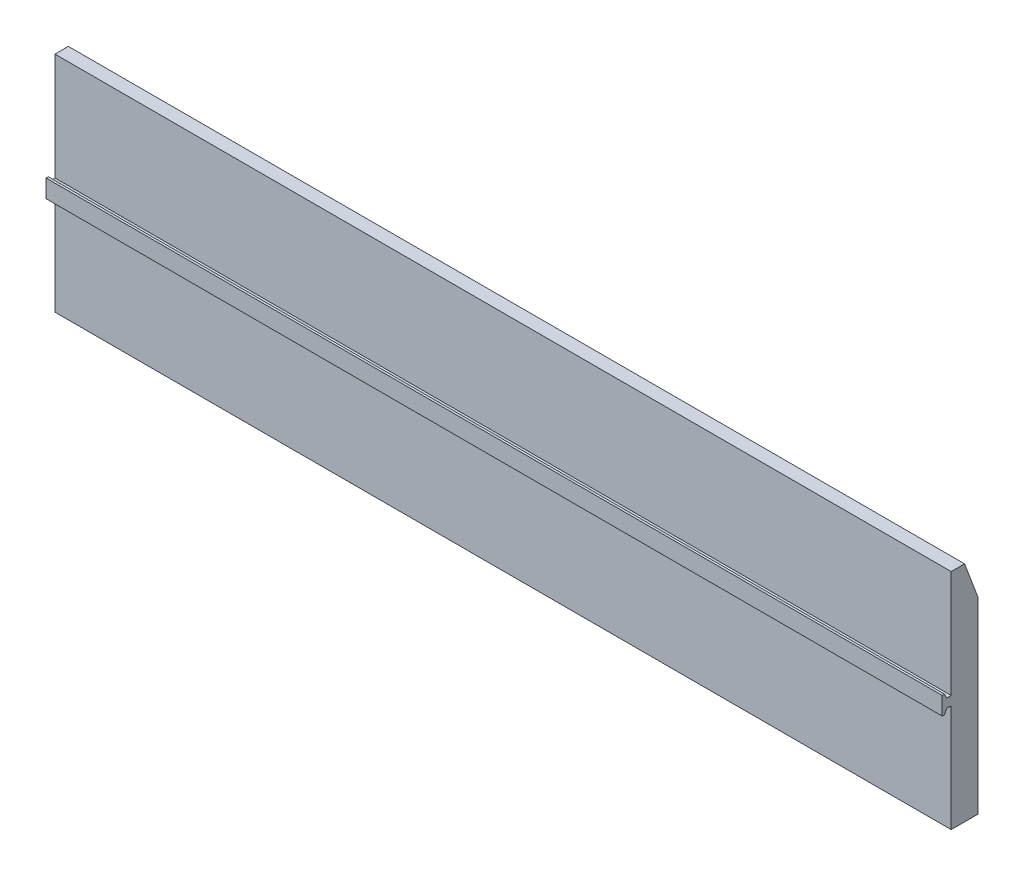
ISO-10303-21;
HEADER;
FILE_DESCRIPTION(('STEP AP214'),'2;1');
FILE_NAME('part.step','',(''),(''),'','','');
FILE_SCHEMA(('AUTOMOTIVE_DESIGN { 1 0 10303 214 1 1 1 1 }'));
ENDSEC;
DATA;
#1=APPLICATION_CONTEXT('core data for automotive mechanical design processes');
#2=APPLICATION_PROTOCOL_DEFINITION('international standard','automotive_design',2000,#1);
#3=PRODUCT_CONTEXT('',#1,'mechanical');
#4=PRODUCT('Part','Part','',(#3));
#5=PRODUCT_RELATED_PRODUCT_CATEGORY('part','',(#4));
#6=PRODUCT_DEFINITION_FORMATION('','',#4);
#7=PRODUCT_DEFINITION_CONTEXT('part definition',#1,'design');
#8=PRODUCT_DEFINITION('design','',#6,#7);
#9=PRODUCT_DEFINITION_SHAPE('','',#8);
#10=(LENGTH_UNIT() NAMED_UNIT(*) SI_UNIT(.MILLI.,.METRE.));
#11=(NAMED_UNIT(*) PLANE_ANGLE_UNIT() SI_UNIT($,.RADIAN.));
#12=(NAMED_UNIT(*) SI_UNIT($,.STERADIAN.) SOLID_ANGLE_UNIT());
#13=UNCERTAINTY_MEASURE_WITH_UNIT(LENGTH_MEASURE(1.E-05),#10,'distance_accuracy_value','');
#14=(GEOMETRIC_REPRESENTATION_CONTEXT(3) GLOBAL_UNCERTAINTY_ASSIGNED_CONTEXT((#13)) GLOBAL_UNIT_ASSIGNED_CONTEXT((#10,
#11,#12)) REPRESENTATION_CONTEXT('',''));
#15=CARTESIAN_POINT('',(0.,0.,0.));
#16=DIRECTION('',(0.,0.,1.));
#17=DIRECTION('',(1.,0.,0.));
#18=AXIS2_PLACEMENT_3D('',#15,#16,#17);
#19=CARTESIAN_POINT('',(25.0000000000001,80.,74.9999999999981));
#20=DIRECTION('',(0.,1.,0.));
#21=DIRECTION('',(0.,0.,1.));
#22=AXIS2_PLACEMENT_3D('',#19,#20,#21);
#23=PLANE('',#22);
#24=CARTESIAN_POINT('',(215.,80.,14.9999999999993));
#25=DIRECTION('',(0.,1.,0.));
#26=DIRECTION('',(0.,0.,1.));
#27=AXIS2_PLACEMENT_3D('',#24,#25,#26);
#28=CIRCLE('',#27,12.);
#29=CARTESIAN_POINT('',(215.,80.,26.9999999999993));
#30=VERTEX_POINT('',#29);
#31=EDGE_CURVE('E410',#30,#30,#28,.T.);
#32=ORIENTED_EDGE('',*,*,#31,.F.);
#33=EDGE_LOOP('',(#32));
#34=FACE_BOUND('',#33,.T.);
#35=CARTESIAN_POINT('',(286.25,80.,14.9999999999993));
#36=DIRECTION('',(0.,1.,0.));
#37=DIRECTION('',(0.,0.,1.));
#38=AXIS2_PLACEMENT_3D('',#35,#36,#37);
#39=CIRCLE('',#38,12.);
#40=CARTESIAN_POINT('',(286.25,80.,26.9999999999993));
#41=VERTEX_POINT('',#40);
#42=EDGE_CURVE('E412',#41,#41,#39,.T.);
#43=ORIENTED_EDGE('',*,*,#42,.F.);
#44=EDGE_LOOP('',(#43));
#45=FACE_BOUND('',#44,.T.);
#46=DIRECTION('',(1.,0.,0.));
#47=VECTOR('',#46,1.);
#48=CARTESIAN_POINT('',(25.0000000000001,80.,-45.0000000000018));
#49=LINE('',#48,#47);
#50=CARTESIAN_POINT('',(175.,80.,-45.0000000000018));
#51=VERTEX_POINT('',#50);
#52=CARTESIAN_POINT('',(326.25,80.,-45.0000000000018));
#53=VERTEX_POINT('',#52);
#54=EDGE_CURVE('E181',#51,#53,#49,.T.);
#55=ORIENTED_EDGE('',*,*,#54,.F.);
#56=DIRECTION('',(0.,0.,-1.));
#57=VECTOR('',#56,1.);
#58=CARTESIAN_POINT('',(175.,80.,74.9999999999981));
#59=LINE('',#58,#57);
#60=CARTESIAN_POINT('',(175.,80.,74.9999999999982));
#61=VERTEX_POINT('',#60);
#62=EDGE_CURVE('E204',#61,#51,#59,.T.);
#63=ORIENTED_EDGE('',*,*,#62,.F.);
#64=DIRECTION('',(1.,0.,0.));
#65=VECTOR('',#64,1.);
#66=CARTESIAN_POINT('',(25.0000000000001,80.,74.9999999999981));
#67=LINE('',#66,#65);
#68=CARTESIAN_POINT('',(326.25,80.,75.0000000000004));
#69=VERTEX_POINT('',#68);
#70=EDGE_CURVE('E305',#61,#69,#67,.T.);
#71=ORIENTED_EDGE('',*,*,#70,.T.);
#72=DIRECTION('',(0.,0.,1.));
#73=VECTOR('',#72,1.);
#74=CARTESIAN_POINT('',(326.25,80.,74.9999999999981));
#75=LINE('',#74,#73);
#76=EDGE_CURVE('E221',#53,#69,#75,.T.);
#77=ORIENTED_EDGE('',*,*,#76,.F.);
#78=EDGE_LOOP('',(#55,#63,#71,#77));
#79=FACE_BOUND('',#78,.T.);
#80=ADVANCED_FACE('F38',(#34,#45,#79),#23,.T.);
#81=CARTESIAN_POINT('',(25.0000000000001,300.,104.999999999998));
#82=DIRECTION('',(0.,1.,0.));
#83=DIRECTION('',(0.,0.,1.));
#84=AXIS2_PLACEMENT_3D('',#81,#82,#83);
#85=PLANE('',#84);
#86=DIRECTION('',(0.,0.,1.));
#87=VECTOR('',#86,1.);
#88=CARTESIAN_POINT('',(1027.5,300.,104.999999999998));
#89=LINE('',#88,#87);
#90=CARTESIAN_POINT('',(1027.5,300.,89.999999999998));
#91=VERTEX_POINT('',#90);
#92=CARTESIAN_POINT('',(1027.5,300.,104.999999999998));
#93=VERTEX_POINT('',#92);
#94=EDGE_CURVE('E223',#91,#93,#89,.T.);
#95=ORIENTED_EDGE('',*,*,#94,.F.);
#96=DIRECTION('',(1.,0.,0.));
#97=VECTOR('',#96,1.);
#98=CARTESIAN_POINT('',(25.0000000000001,300.,89.999999999998));
#99=LINE('',#98,#97);
#100=CARTESIAN_POINT('',(25.0000000000001,300.,89.999999999998));
#101=VERTEX_POINT('',#100);
#102=EDGE_CURVE('E46',#101,#91,#99,.T.);
#103=ORIENTED_EDGE('',*,*,#102,.F.);
#104=DIRECTION('',(0.,0.,1.));
#105=VECTOR('',#104,1.);
#106=CARTESIAN_POINT('',(25.0000000000001,300.,104.999999999998));
#107=LINE('',#106,#105);
#108=CARTESIAN_POINT('',(25.0000000000001,300.,104.999999999998));
#109=VERTEX_POINT('',#108);
#110=EDGE_CURVE('E224',#101,#109,#107,.T.);
#111=ORIENTED_EDGE('',*,*,#110,.T.);
#112=DIRECTION('',(1.,0.,0.));
#113=VECTOR('',#112,1.);
#114=CARTESIAN_POINT('',(25.0000000000001,300.,104.999999999998));
#115=LINE('',#114,#113);
#116=EDGE_CURVE('E264',#109,#93,#115,.T.);
#117=ORIENTED_EDGE('',*,*,#116,.T.);
#118=EDGE_LOOP('',(#95,#103,#111,#117));
#119=FACE_BOUND('',#118,.T.);
#120=ADVANCED_FACE('F40',(#119),#85,.T.);
#121=CARTESIAN_POINT('',(25.0000000000001,300.,89.999999999998));
#122=DIRECTION('',(0.,0.351123441588388,-0.936329177569046));
#123=DIRECTION('',(0.,0.936329177569046,0.351123441588388));
#124=AXIS2_PLACEMENT_3D('',#121,#122,#123);
#125=PLANE('',#124);
#126=DIRECTION('',(0.,0.936329177569046,0.351123441588388));
#127=VECTOR('',#126,1.);
#128=CARTESIAN_POINT('',(1027.5,300.,89.999999999998));
#129=LINE('',#128,#127);
#130=CARTESIAN_POINT('',(1027.5,260.,74.9999999999982));
#131=VERTEX_POINT('',#130);
#132=EDGE_CURVE('E228',#131,#91,#129,.T.);
#133=ORIENTED_EDGE('',*,*,#132,.F.);
#134=DIRECTION('',(1.,0.,0.));
#135=VECTOR('',#134,1.);
#136=CARTESIAN_POINT('',(25.0000000000001,260.,74.9999999999982));
#137=LINE('',#136,#135);
#138=CARTESIAN_POINT('',(25.0000000000001,260.,74.9999999999982));
#139=VERTEX_POINT('',#138);
#140=EDGE_CURVE('E303',#139,#131,#137,.T.);
#141=ORIENTED_EDGE('',*,*,#140,.F.);
#142=DIRECTION('',(0.,0.936329177569046,0.351123441588388));
#143=VECTOR('',#142,1.);
#144=CARTESIAN_POINT('',(25.0000000000001,300.,89.999999999998));
#145=LINE('',#144,#143);
#146=EDGE_CURVE('E261',#139,#101,#145,.T.);
#147=ORIENTED_EDGE('',*,*,#146,.T.);
#148=ORIENTED_EDGE('',*,*,#102,.T.);
#149=EDGE_LOOP('',(#133,#141,#147,#148));
#150=FACE_BOUND('',#149,.T.);
#151=ADVANCED_FACE('F339',(#150),#125,.T.);
#152=CARTESIAN_POINT('',(25.0000000000001,260.,74.9999999999982));
#153=DIRECTION('',(0.,0.,-1.));
#154=DIRECTION('',(0.,1.,0.));
#155=AXIS2_PLACEMENT_3D('',#152,#153,#154);
#156=PLANE('',#155);
#157=ORIENTED_EDGE('',*,*,#70,.F.);
#158=DIRECTION('',(0.,1.,0.));
#159=VECTOR('',#158,1.);
#160=CARTESIAN_POINT('',(175.,50.,74.9999999999982));
#161=LINE('',#160,#159);
#162=CARTESIAN_POINT('',(175.,50.,74.9999999999982));
#163=VERTEX_POINT('',#162);
#164=EDGE_CURVE('E381',#163,#61,#161,.T.);
#165=ORIENTED_EDGE('',*,*,#164,.F.);
#166=DIRECTION('',(1.,0.,0.));
#167=VECTOR('',#166,1.);
#168=CARTESIAN_POINT('',(24.9999999999997,50.,74.9999999999982));
#169=LINE('',#168,#167);
#170=CARTESIAN_POINT('',(25.0000000000001,50.,74.9999999999982));
#171=VERTEX_POINT('',#170);
#172=EDGE_CURVE('E378',#171,#163,#169,.T.);
#173=ORIENTED_EDGE('',*,*,#172,.F.);
#174=DIRECTION('',(0.,1.,0.));
#175=VECTOR('',#174,1.);
#176=CARTESIAN_POINT('',(25.0000000000001,260.,74.9999999999982));
#177=LINE('',#176,#175);
#178=EDGE_CURVE('E258',#171,#139,#177,.T.);
#179=ORIENTED_EDGE('',*,*,#178,.T.);
#180=ORIENTED_EDGE('',*,*,#140,.T.);
#181=DIRECTION('',(0.,1.,0.));
#182=VECTOR('',#181,1.);
#183=CARTESIAN_POINT('',(1027.5,260.,74.9999999999982));
#184=LINE('',#183,#182);
#185=CARTESIAN_POINT('',(1027.5,50.,75.0000000000005));
#186=VERTEX_POINT('',#185);
#187=EDGE_CURVE('E297',#186,#131,#184,.T.);
#188=ORIENTED_EDGE('',*,*,#187,.F.);
#189=DIRECTION('',(1.,0.,0.));
#190=VECTOR('',#189,1.);
#191=CARTESIAN_POINT('',(1027.5,50.,75.0000000000005));
#192=LINE('',#191,#190);
#193=CARTESIAN_POINT('',(877.5,50.,75.0000000000004));
#194=VERTEX_POINT('',#193);
#195=EDGE_CURVE('E385',#194,#186,#192,.T.);
#196=ORIENTED_EDGE('',*,*,#195,.F.);
#197=DIRECTION('',(0.,1.,0.));
#198=VECTOR('',#197,1.);
#199=CARTESIAN_POINT('',(877.5,50.,75.0000000000004));
#200=LINE('',#199,#198);
#201=CARTESIAN_POINT('',(877.5,80.,75.0000000000004));
#202=VERTEX_POINT('',#201);
#203=EDGE_CURVE('E392',#194,#202,#200,.T.);
#204=ORIENTED_EDGE('',*,*,#203,.T.);
#205=CARTESIAN_POINT('',(726.25,80.,75.0000000000004));
#206=VERTEX_POINT('',#205);
#207=EDGE_CURVE('E308',#206,#202,#67,.T.);
#208=ORIENTED_EDGE('',*,*,#207,.F.);
#209=DIRECTION('',(0.,1.,0.));
#210=VECTOR('',#209,1.);
#211=CARTESIAN_POINT('',(726.25,50.,75.0000000000004));
#212=LINE('',#211,#210);
#213=CARTESIAN_POINT('',(726.25,50.,75.0000000000004));
#214=VERTEX_POINT('',#213);
#215=EDGE_CURVE('E215',#214,#206,#212,.T.);
#216=ORIENTED_EDGE('',*,*,#215,.F.);
#217=DIRECTION('',(1.,0.,0.));
#218=VECTOR('',#217,1.);
#219=CARTESIAN_POINT('',(326.25,50.,75.0000000000004));
#220=LINE('',#219,#218);
#221=CARTESIAN_POINT('',(326.25,50.,75.0000000000004));
#222=VERTEX_POINT('',#221);
#223=EDGE_CURVE('E203',#222,#214,#220,.T.);
#224=ORIENTED_EDGE('',*,*,#223,.F.);
#225=DIRECTION('',(0.,1.,0.));
#226=VECTOR('',#225,1.);
#227=CARTESIAN_POINT('',(326.25,50.,75.0000000000004));
#228=LINE('',#227,#226);
#229=EDGE_CURVE('E201',#222,#69,#228,.T.);
#230=ORIENTED_EDGE('',*,*,#229,.T.);
#231=EDGE_LOOP('',(#157,#165,#173,#179,#180,#188,#196,#204,#208,#216,#224,#230));
#232=FACE_BOUND('',#231,.T.);
#233=ADVANCED_FACE('F380',(#232),#156,.T.);
#234=CARTESIAN_POINT('',(766.25,80.,14.9999999999993));
#235=DIRECTION('',(0.,1.,0.));
#236=DIRECTION('',(0.,0.,1.));
#237=AXIS2_PLACEMENT_3D('',#234,#235,#236);
#238=CIRCLE('',#237,12.);
#239=CARTESIAN_POINT('',(766.25,80.,26.9999999999993));
#240=VERTEX_POINT('',#239);
#241=EDGE_CURVE('E419',#240,#240,#238,.T.);
#242=ORIENTED_EDGE('',*,*,#241,.F.);
#243=EDGE_LOOP('',(#242));
#244=FACE_BOUND('',#243,.T.);
#245=CARTESIAN_POINT('',(837.5,80.,14.9999999999993));
#246=DIRECTION('',(0.,1.,0.));
#247=DIRECTION('',(0.,0.,1.));
#248=AXIS2_PLACEMENT_3D('',#245,#246,#247);
#249=CIRCLE('',#248,12.);
#250=CARTESIAN_POINT('',(837.5,80.,26.9999999999993));
#251=VERTEX_POINT('',#250);
#252=EDGE_CURVE('E422',#251,#251,#249,.T.);
#253=ORIENTED_EDGE('',*,*,#252,.F.);
#254=EDGE_LOOP('',(#253));
#255=FACE_BOUND('',#254,.T.);
#256=DIRECTION('',(1.,0.,0.));
#257=VECTOR('',#256,1.);
#258=CARTESIAN_POINT('',(25.0000000000001,80.,-45.0000000000018));
#259=LINE('',#258,#257);
#260=CARTESIAN_POINT('',(726.25,80.,-45.0000000000018));
#261=VERTEX_POINT('',#260);
#262=CARTESIAN_POINT('',(877.5,80.,-45.0000000000018));
#263=VERTEX_POINT('',#262);
#264=EDGE_CURVE('E53',#261,#263,#259,.T.);
#265=ORIENTED_EDGE('',*,*,#264,.F.);
#266=DIRECTION('',(0.,0.,-1.));
#267=VECTOR('',#266,1.);
#268=CARTESIAN_POINT('',(726.25,80.,74.9999999999981));
#269=LINE('',#268,#267);
#270=EDGE_CURVE('E217',#206,#261,#269,.T.);
#271=ORIENTED_EDGE('',*,*,#270,.F.);
#272=ORIENTED_EDGE('',*,*,#207,.T.);
#273=DIRECTION('',(0.,0.,1.));
#274=VECTOR('',#273,1.);
#275=CARTESIAN_POINT('',(877.5,80.,74.9999999999971));
#276=LINE('',#275,#274);
#277=EDGE_CURVE('E209',#263,#202,#276,.T.);
#278=ORIENTED_EDGE('',*,*,#277,.F.);
#279=EDGE_LOOP('',(#265,#271,#272,#278));
#280=FACE_BOUND('',#279,.T.);
#281=ADVANCED_FACE('F406',(#244,#255,#280),#23,.T.);
#282=CARTESIAN_POINT('',(25.0000000000001,50.,74.9999999999982));
#283=DIRECTION('',(0.,-1.,0.));
#284=DIRECTION('',(0.,0.,-1.));
#285=AXIS2_PLACEMENT_3D('',#282,#283,#284);
#286=PLANE('',#285);
#287=CARTESIAN_POINT('',(215.,50.,14.9999999999993));
#288=DIRECTION('',(0.,1.,0.));
#289=DIRECTION('',(0.,0.,1.));
#290=AXIS2_PLACEMENT_3D('',#287,#288,#289);
#291=CIRCLE('',#290,12.);
#292=CARTESIAN_POINT('',(215.,50.,26.9999999999993));
#293=VERTEX_POINT('',#292);
#294=EDGE_CURVE('E425',#293,#293,#291,.T.);
#295=ORIENTED_EDGE('',*,*,#294,.T.);
#296=EDGE_LOOP('',(#295));
#297=FACE_BOUND('',#296,.T.);
#298=CARTESIAN_POINT('',(286.25,50.,14.9999999999993));
#299=DIRECTION('',(0.,1.,0.));
#300=DIRECTION('',(0.,0.,1.));
#301=AXIS2_PLACEMENT_3D('',#298,#299,#300);
#302=CIRCLE('',#301,12.);
#303=CARTESIAN_POINT('',(286.25,50.,26.9999999999993));
#304=VERTEX_POINT('',#303);
#305=EDGE_CURVE('E432',#304,#304,#302,.T.);
#306=ORIENTED_EDGE('',*,*,#305,.T.);
#307=EDGE_LOOP('',(#306));
#308=FACE_BOUND('',#307,.T.);
#309=CARTESIAN_POINT('',(766.25,50.,14.9999999999993));
#310=DIRECTION('',(0.,1.,0.));
#311=DIRECTION('',(0.,0.,1.));
#312=AXIS2_PLACEMENT_3D('',#309,#310,#311);
#313=CIRCLE('',#312,12.);
#314=CARTESIAN_POINT('',(766.25,50.,26.9999999999993));
#315=VERTEX_POINT('',#314);
#316=EDGE_CURVE('E429',#315,#315,#313,.T.);
#317=ORIENTED_EDGE('',*,*,#316,.T.);
#318=EDGE_LOOP('',(#317));
#319=FACE_BOUND('',#318,.T.);
#320=CARTESIAN_POINT('',(837.5,50.,14.9999999999993));
#321=DIRECTION('',(0.,1.,0.));
#322=DIRECTION('',(0.,0.,1.));
#323=AXIS2_PLACEMENT_3D('',#320,#321,#322);
#324=CIRCLE('',#323,12.);
#325=CARTESIAN_POINT('',(837.5,50.,26.9999999999993));
#326=VERTEX_POINT('',#325);
#327=EDGE_CURVE('E426',#326,#326,#324,.T.);
#328=ORIENTED_EDGE('',*,*,#327,.T.);
#329=EDGE_LOOP('',(#328));
#330=FACE_BOUND('',#329,.T.);
#331=DIRECTION('',(1.,0.,0.));
#332=VECTOR('',#331,1.);
#333=CARTESIAN_POINT('',(45.4316577057523,50.,-45.0000000000018));
#334=LINE('',#333,#332);
#335=CARTESIAN_POINT('',(726.25,50.,-45.0000000000018));
#336=VERTEX_POINT('',#335);
#337=CARTESIAN_POINT('',(877.5,50.,-45.0000000000018));
#338=VERTEX_POINT('',#337);
#339=EDGE_CURVE('E197',#336,#338,#334,.T.);
#340=ORIENTED_EDGE('',*,*,#339,.T.);
#341=DIRECTION('',(0.,0.,1.));
#342=VECTOR('',#341,1.);
#343=CARTESIAN_POINT('',(877.5,50.,-110.));
#344=LINE('',#343,#342);
#345=EDGE_CURVE('E382',#338,#194,#344,.T.);
#346=ORIENTED_EDGE('',*,*,#345,.T.);
#347=ORIENTED_EDGE('',*,*,#195,.T.);
#348=DIRECTION('',(0.,0.,-1.));
#349=VECTOR('',#348,1.);
#350=CARTESIAN_POINT('',(1027.5,50.,74.9999999999982));
#351=LINE('',#350,#349);
#352=CARTESIAN_POINT('',(1027.5,50.,104.999999999998));
#353=VERTEX_POINT('',#352);
#354=EDGE_CURVE('E294',#353,#186,#351,.T.);
#355=ORIENTED_EDGE('',*,*,#354,.F.);
#356=DIRECTION('',(1.,0.,0.));
#357=VECTOR('',#356,1.);
#358=CARTESIAN_POINT('',(25.0000000000001,50.,104.999999999998));
#359=LINE('',#358,#357);
#360=CARTESIAN_POINT('',(25.0000000000001,50.,104.999999999998));
#361=VERTEX_POINT('',#360);
#362=EDGE_CURVE('E309',#361,#353,#359,.T.);
#363=ORIENTED_EDGE('',*,*,#362,.F.);
#364=DIRECTION('',(0.,0.,-1.));
#365=VECTOR('',#364,1.);
#366=CARTESIAN_POINT('',(25.0000000000001,50.,74.9999999999982));
#367=LINE('',#366,#365);
#368=EDGE_CURVE('E255',#361,#171,#367,.T.);
#369=ORIENTED_EDGE('',*,*,#368,.T.);
#370=ORIENTED_EDGE('',*,*,#172,.T.);
#371=DIRECTION('',(0.,0.,-1.));
#372=VECTOR('',#371,1.);
#373=CARTESIAN_POINT('',(175.,50.,-110.000000000002));
#374=LINE('',#373,#372);
#375=CARTESIAN_POINT('',(175.,50.,-45.0000000000019));
#376=VERTEX_POINT('',#375);
#377=EDGE_CURVE('E196',#163,#376,#374,.T.);
#378=ORIENTED_EDGE('',*,*,#377,.T.);
#379=CARTESIAN_POINT('',(326.25,50.,-45.0000000000018));
#380=VERTEX_POINT('',#379);
#381=EDGE_CURVE('E61',#376,#380,#334,.T.);
#382=ORIENTED_EDGE('',*,*,#381,.T.);
#383=DIRECTION('',(0.,0.,1.));
#384=VECTOR('',#383,1.);
#385=CARTESIAN_POINT('',(326.25,50.,-110.000000000002));
#386=LINE('',#385,#384);
#387=EDGE_CURVE('E192',#380,#222,#386,.T.);
#388=ORIENTED_EDGE('',*,*,#387,.T.);
#389=ORIENTED_EDGE('',*,*,#223,.T.);
#390=DIRECTION('',(0.,0.,-1.));
#391=VECTOR('',#390,1.);
#392=CARTESIAN_POINT('',(726.25,50.,-110.000000000002));
#393=LINE('',#392,#391);
#394=EDGE_CURVE('E206',#214,#336,#393,.T.);
#395=ORIENTED_EDGE('',*,*,#394,.T.);
#396=EDGE_LOOP('',(#340,#346,#347,#355,#363,#369,#370,#378,#382,#388,#389,#395));
#397=FACE_BOUND('',#396,.T.);
#398=ADVANCED_FACE('F190',(#297,#308,#319,#330,#397),#286,.T.);
#399=CARTESIAN_POINT('',(25.0000000000001,170.,104.999999999998));
#400=DIRECTION('',(0.,0.,1.));
#401=DIRECTION('',(1.,0.,0.));
#402=AXIS2_PLACEMENT_3D('',#399,#400,#401);
#403=PLANE('',#402);
#404=DIRECTION('',(0.,-1.,0.));
#405=VECTOR('',#404,1.);
#406=CARTESIAN_POINT('',(1027.5,170.,104.999999999998));
#407=LINE('',#406,#405);
#408=CARTESIAN_POINT('',(1027.5,170.,104.999999999998));
#409=VERTEX_POINT('',#408);
#410=EDGE_CURVE('E291',#409,#353,#407,.T.);
#411=ORIENTED_EDGE('',*,*,#410,.F.);
#412=DIRECTION('',(1.,0.,0.));
#413=VECTOR('',#412,1.);
#414=CARTESIAN_POINT('',(25.0000000000001,170.,104.999999999998));
#415=LINE('',#414,#413);
#416=CARTESIAN_POINT('',(25.0000000000001,170.,104.999999999998));
#417=VERTEX_POINT('',#416);
#418=EDGE_CURVE('E312',#417,#409,#415,.T.);
#419=ORIENTED_EDGE('',*,*,#418,.F.);
#420=DIRECTION('',(0.,-1.,0.));
#421=VECTOR('',#420,1.);
#422=CARTESIAN_POINT('',(25.0000000000001,170.,104.999999999998));
#423=LINE('',#422,#421);
#424=EDGE_CURVE('E252',#417,#361,#423,.T.);
#425=ORIENTED_EDGE('',*,*,#424,.T.);
#426=ORIENTED_EDGE('',*,*,#362,.T.);
#427=EDGE_LOOP('',(#411,#419,#425,#426));
#428=FACE_BOUND('',#427,.T.);
#429=ADVANCED_FACE('F372',(#428),#403,.T.);
#430=CARTESIAN_POINT('',(25.0000000000001,170.,109.999999999998));
#431=DIRECTION('',(0.,-1.,0.));
#432=DIRECTION('',(0.,0.,-1.));
#433=AXIS2_PLACEMENT_3D('',#430,#431,#432);
#434=PLANE('',#433);
#435=DIRECTION('',(0.,0.,-1.));
#436=VECTOR('',#435,1.);
#437=CARTESIAN_POINT('',(1027.5,170.,109.999999999998));
#438=LINE('',#437,#436);
#439=CARTESIAN_POINT('',(1027.5,170.,109.999999999998));
#440=VERTEX_POINT('',#439);
#441=EDGE_CURVE('E288',#440,#409,#438,.T.);
#442=ORIENTED_EDGE('',*,*,#441,.F.);
#443=DIRECTION('',(1.,0.,0.));
#444=VECTOR('',#443,1.);
#445=CARTESIAN_POINT('',(25.0000000000001,170.,109.999999999998));
#446=LINE('',#445,#444);
#447=CARTESIAN_POINT('',(25.0000000000001,170.,109.999999999998));
#448=VERTEX_POINT('',#447);
#449=EDGE_CURVE('E314',#448,#440,#446,.T.);
#450=ORIENTED_EDGE('',*,*,#449,.F.);
#451=DIRECTION('',(0.,0.,-1.));
#452=VECTOR('',#451,1.);
#453=CARTESIAN_POINT('',(25.0000000000001,170.,109.999999999998));
#454=LINE('',#453,#452);
#455=EDGE_CURVE('E249',#448,#417,#454,.T.);
#456=ORIENTED_EDGE('',*,*,#455,.T.);
#457=ORIENTED_EDGE('',*,*,#418,.T.);
#458=EDGE_LOOP('',(#442,#450,#456,#457));
#459=FACE_BOUND('',#458,.T.);
#460=ADVANCED_FACE('F369',(#459),#434,.T.);
#461=CARTESIAN_POINT('',(25.0000000000001,165.,112.499999999998));
#462=DIRECTION('',(0.,-0.44721359549996,-0.894427190999915));
#463=DIRECTION('',(0.,0.894427190999915,-0.44721359549996));
#464=AXIS2_PLACEMENT_3D('',#461,#462,#463);
#465=PLANE('',#464);
#466=DIRECTION('',(0.,0.894427190999915,-0.44721359549996));
#467=VECTOR('',#466,1.);
#468=CARTESIAN_POINT('',(1027.5,165.,112.499999999998));
#469=LINE('',#468,#467);
#470=CARTESIAN_POINT('',(1027.5,165.,112.499999999998));
#471=VERTEX_POINT('',#470);
#472=EDGE_CURVE('E285',#471,#440,#469,.T.);
#473=ORIENTED_EDGE('',*,*,#472,.F.);
#474=DIRECTION('',(1.,0.,0.));
#475=VECTOR('',#474,1.);
#476=CARTESIAN_POINT('',(25.0000000000001,165.,112.499999999998));
#477=LINE('',#476,#475);
#478=CARTESIAN_POINT('',(25.0000000000001,165.,112.499999999998));
#479=VERTEX_POINT('',#478);
#480=EDGE_CURVE('E316',#479,#471,#477,.T.);
#481=ORIENTED_EDGE('',*,*,#480,.F.);
#482=DIRECTION('',(0.,0.894427190999915,-0.44721359549996));
#483=VECTOR('',#482,1.);
#484=CARTESIAN_POINT('',(25.0000000000001,165.,112.499999999998));
#485=LINE('',#484,#483);
#486=EDGE_CURVE('E246',#479,#448,#485,.T.);
#487=ORIENTED_EDGE('',*,*,#486,.T.);
#488=ORIENTED_EDGE('',*,*,#449,.T.);
#489=EDGE_LOOP('',(#473,#481,#487,#488));
#490=FACE_BOUND('',#489,.T.);
#491=ADVANCED_FACE('F365',(#490),#465,.T.);
#492=CARTESIAN_POINT('',(25.0000000000001,165.,114.999999999998));
#493=DIRECTION('',(0.,-1.,0.));
#494=DIRECTION('',(0.,0.,-1.));
#495=AXIS2_PLACEMENT_3D('',#492,#493,#494);
#496=PLANE('',#495);
#497=DIRECTION('',(0.,0.,-1.));
#498=VECTOR('',#497,1.);
#499=CARTESIAN_POINT('',(1027.5,165.,114.999999999998));
#500=LINE('',#499,#498);
#501=CARTESIAN_POINT('',(1027.5,165.,114.999999999998));
#502=VERTEX_POINT('',#501);
#503=EDGE_CURVE('E282',#502,#471,#500,.T.);
#504=ORIENTED_EDGE('',*,*,#503,.F.);
#505=DIRECTION('',(1.,0.,0.));
#506=VECTOR('',#505,1.);
#507=CARTESIAN_POINT('',(25.0000000000001,165.,114.999999999998));
#508=LINE('',#507,#506);
#509=CARTESIAN_POINT('',(25.0000000000001,165.,114.999999999998));
#510=VERTEX_POINT('',#509);
#511=EDGE_CURVE('E318',#510,#502,#508,.T.);
#512=ORIENTED_EDGE('',*,*,#511,.F.);
#513=DIRECTION('',(0.,0.,-1.));
#514=VECTOR('',#513,1.);
#515=CARTESIAN_POINT('',(25.0000000000001,165.,114.999999999998));
#516=LINE('',#515,#514);
#517=EDGE_CURVE('E243',#510,#479,#516,.T.);
#518=ORIENTED_EDGE('',*,*,#517,.T.);
#519=ORIENTED_EDGE('',*,*,#480,.T.);
#520=EDGE_LOOP('',(#504,#512,#518,#519));
#521=FACE_BOUND('',#520,.T.);
#522=ADVANCED_FACE('F361',(#521),#496,.T.);
#523=CARTESIAN_POINT('',(25.0000000000001,185.,114.999999999998));
#524=DIRECTION('',(0.,0.,1.));
#525=DIRECTION('',(1.,0.,0.));
#526=AXIS2_PLACEMENT_3D('',#523,#524,#525);
#527=PLANE('',#526);
#528=DIRECTION('',(0.,-1.,0.));
#529=VECTOR('',#528,1.);
#530=CARTESIAN_POINT('',(1027.5,185.,114.999999999998));
#531=LINE('',#530,#529);
#532=CARTESIAN_POINT('',(1027.5,185.,114.999999999998));
#533=VERTEX_POINT('',#532);
#534=EDGE_CURVE('E279',#533,#502,#531,.T.);
#535=ORIENTED_EDGE('',*,*,#534,.F.);
#536=DIRECTION('',(1.,0.,0.));
#537=VECTOR('',#536,1.);
#538=CARTESIAN_POINT('',(25.0000000000001,185.,114.999999999998));
#539=LINE('',#538,#537);
#540=CARTESIAN_POINT('',(25.0000000000001,185.,114.999999999998));
#541=VERTEX_POINT('',#540);
#542=EDGE_CURVE('E320',#541,#533,#539,.T.);
#543=ORIENTED_EDGE('',*,*,#542,.F.);
#544=DIRECTION('',(0.,-1.,0.));
#545=VECTOR('',#544,1.);
#546=CARTESIAN_POINT('',(25.0000000000001,185.,114.999999999998));
#547=LINE('',#546,#545);
#548=EDGE_CURVE('E240',#541,#510,#547,.T.);
#549=ORIENTED_EDGE('',*,*,#548,.T.);
#550=ORIENTED_EDGE('',*,*,#511,.T.);
#551=EDGE_LOOP('',(#535,#543,#549,#550));
#552=FACE_BOUND('',#551,.T.);
#553=ADVANCED_FACE('F357',(#552),#527,.T.);
#554=CARTESIAN_POINT('',(25.0000000000001,185.,112.499999999998));
#555=DIRECTION('',(0.,1.,0.));
#556=DIRECTION('',(0.,0.,1.));
#557=AXIS2_PLACEMENT_3D('',#554,#555,#556);
#558=PLANE('',#557);
#559=DIRECTION('',(0.,0.,1.));
#560=VECTOR('',#559,1.);
#561=CARTESIAN_POINT('',(1027.5,185.,112.499999999998));
#562=LINE('',#561,#560);
#563=CARTESIAN_POINT('',(1027.5,185.,112.499999999998));
#564=VERTEX_POINT('',#563);
#565=EDGE_CURVE('E276',#564,#533,#562,.T.);
#566=ORIENTED_EDGE('',*,*,#565,.F.);
#567=DIRECTION('',(1.,0.,0.));
#568=VECTOR('',#567,1.);
#569=CARTESIAN_POINT('',(25.0000000000001,185.,112.499999999998));
#570=LINE('',#569,#568);
#571=CARTESIAN_POINT('',(25.0000000000001,185.,112.499999999998));
#572=VERTEX_POINT('',#571);
#573=EDGE_CURVE('E322',#572,#564,#570,.T.);
#574=ORIENTED_EDGE('',*,*,#573,.F.);
#575=DIRECTION('',(0.,0.,1.));
#576=VECTOR('',#575,1.);
#577=CARTESIAN_POINT('',(25.0000000000001,185.,112.499999999998));
#578=LINE('',#577,#576);
#579=EDGE_CURVE('E237',#572,#541,#578,.T.);
#580=ORIENTED_EDGE('',*,*,#579,.T.);
#581=ORIENTED_EDGE('',*,*,#542,.T.);
#582=EDGE_LOOP('',(#566,#574,#580,#581));
#583=FACE_BOUND('',#582,.T.);
#584=ADVANCED_FACE('F353',(#583),#558,.T.);
#585=CARTESIAN_POINT('',(25.0000000000001,180.,109.999999999998));
#586=DIRECTION('',(0.,0.447213595499956,-0.894427190999917));
#587=DIRECTION('',(0.,0.894427190999917,0.447213595499956));
#588=AXIS2_PLACEMENT_3D('',#585,#586,#587);
#589=PLANE('',#588);
#590=DIRECTION('',(0.,0.894427190999917,0.447213595499956));
#591=VECTOR('',#590,1.);
#592=CARTESIAN_POINT('',(1027.5,180.,109.999999999998));
#593=LINE('',#592,#591);
#594=CARTESIAN_POINT('',(1027.5,180.,109.999999999998));
#595=VERTEX_POINT('',#594);
#596=EDGE_CURVE('E273',#595,#564,#593,.T.);
#597=ORIENTED_EDGE('',*,*,#596,.F.);
#598=DIRECTION('',(1.,0.,0.));
#599=VECTOR('',#598,1.);
#600=CARTESIAN_POINT('',(25.0000000000001,180.,109.999999999998));
#601=LINE('',#600,#599);
#602=CARTESIAN_POINT('',(25.0000000000001,180.,109.999999999998));
#603=VERTEX_POINT('',#602);
#604=EDGE_CURVE('E324',#603,#595,#601,.T.);
#605=ORIENTED_EDGE('',*,*,#604,.F.);
#606=DIRECTION('',(0.,0.894427190999917,0.447213595499956));
#607=VECTOR('',#606,1.);
#608=CARTESIAN_POINT('',(25.0000000000001,180.,109.999999999998));
#609=LINE('',#608,#607);
#610=EDGE_CURVE('E234',#603,#572,#609,.T.);
#611=ORIENTED_EDGE('',*,*,#610,.T.);
#612=ORIENTED_EDGE('',*,*,#573,.T.);
#613=EDGE_LOOP('',(#597,#605,#611,#612));
#614=FACE_BOUND('',#613,.T.);
#615=ADVANCED_FACE('F351',(#614),#589,.T.);
#616=CARTESIAN_POINT('',(25.0000000000001,180.,104.999999999998));
#617=DIRECTION('',(0.,1.,0.));
#618=DIRECTION('',(0.,0.,1.));
#619=AXIS2_PLACEMENT_3D('',#616,#617,#618);
#620=PLANE('',#619);
#621=DIRECTION('',(0.,0.,1.));
#622=VECTOR('',#621,1.);
#623=CARTESIAN_POINT('',(1027.5,180.,104.999999999998));
#624=LINE('',#623,#622);
#625=CARTESIAN_POINT('',(1027.5,180.,104.999999999998));
#626=VERTEX_POINT('',#625);
#627=EDGE_CURVE('E270',#626,#595,#624,.T.);
#628=ORIENTED_EDGE('',*,*,#627,.F.);
#629=DIRECTION('',(1.,0.,0.));
#630=VECTOR('',#629,1.);
#631=CARTESIAN_POINT('',(25.0000000000001,180.,104.999999999998));
#632=LINE('',#631,#630);
#633=CARTESIAN_POINT('',(25.0000000000001,180.,104.999999999998));
#634=VERTEX_POINT('',#633);
#635=EDGE_CURVE('E326',#634,#626,#632,.T.);
#636=ORIENTED_EDGE('',*,*,#635,.F.);
#637=DIRECTION('',(0.,0.,1.));
#638=VECTOR('',#637,1.);
#639=CARTESIAN_POINT('',(25.0000000000001,180.,104.999999999998));
#640=LINE('',#639,#638);
#641=EDGE_CURVE('E231',#634,#603,#640,.T.);
#642=ORIENTED_EDGE('',*,*,#641,.T.);
#643=ORIENTED_EDGE('',*,*,#604,.T.);
#644=EDGE_LOOP('',(#628,#636,#642,#643));
#645=FACE_BOUND('',#644,.T.);
#646=ADVANCED_FACE('F347',(#645),#620,.T.);
#647=CARTESIAN_POINT('',(25.0000000000001,300.,104.999999999998));
#648=DIRECTION('',(0.,0.,1.));
#649=DIRECTION('',(1.,0.,0.));
#650=AXIS2_PLACEMENT_3D('',#647,#648,#649);
#651=PLANE('',#650);
#652=DIRECTION('',(0.,-1.,0.));
#653=VECTOR('',#652,1.);
#654=CARTESIAN_POINT('',(1027.5,300.,104.999999999998));
#655=LINE('',#654,#653);
#656=EDGE_CURVE('E267',#93,#626,#655,.T.);
#657=ORIENTED_EDGE('',*,*,#656,.F.);
#658=ORIENTED_EDGE('',*,*,#116,.F.);
#659=DIRECTION('',(0.,-1.,0.));
#660=VECTOR('',#659,1.);
#661=CARTESIAN_POINT('',(25.0000000000001,300.,104.999999999998));
#662=LINE('',#661,#660);
#663=EDGE_CURVE('E227',#109,#634,#662,.T.);
#664=ORIENTED_EDGE('',*,*,#663,.T.);
#665=ORIENTED_EDGE('',*,*,#635,.T.);
#666=EDGE_LOOP('',(#657,#658,#664,#665));
#667=FACE_BOUND('',#666,.T.);
#668=ADVANCED_FACE('F333',(#667),#651,.T.);
#669=CARTESIAN_POINT('',(25.0000000000001,0.,0.));
#670=DIRECTION('',(-1.,0.,0.));
#671=DIRECTION('',(0.,0.,1.));
#672=AXIS2_PLACEMENT_3D('',#669,#670,#671);
#673=PLANE('',#672);
#674=ORIENTED_EDGE('',*,*,#178,.F.);
#675=ORIENTED_EDGE('',*,*,#368,.F.);
#676=ORIENTED_EDGE('',*,*,#424,.F.);
#677=ORIENTED_EDGE('',*,*,#455,.F.);
#678=ORIENTED_EDGE('',*,*,#486,.F.);
#679=ORIENTED_EDGE('',*,*,#517,.F.);
#680=ORIENTED_EDGE('',*,*,#548,.F.);
#681=ORIENTED_EDGE('',*,*,#579,.F.);
#682=ORIENTED_EDGE('',*,*,#610,.F.);
#683=ORIENTED_EDGE('',*,*,#641,.F.);
#684=ORIENTED_EDGE('',*,*,#663,.F.);
#685=ORIENTED_EDGE('',*,*,#110,.F.);
#686=ORIENTED_EDGE('',*,*,#146,.F.);
#687=EDGE_LOOP('',(#674,#675,#676,#677,#678,#679,#680,#681,#682,#683,#684,#685,#686));
#688=FACE_BOUND('',#687,.T.);
#689=ADVANCED_FACE('F342',(#688),#673,.T.);
#690=CARTESIAN_POINT('',(1027.5,0.,0.));
#691=DIRECTION('',(-1.,0.,0.));
#692=DIRECTION('',(0.,0.,1.));
#693=AXIS2_PLACEMENT_3D('',#690,#691,#692);
#694=PLANE('',#693);
#695=ORIENTED_EDGE('',*,*,#354,.T.);
#696=ORIENTED_EDGE('',*,*,#187,.T.);
#697=ORIENTED_EDGE('',*,*,#132,.T.);
#698=ORIENTED_EDGE('',*,*,#94,.T.);
#699=ORIENTED_EDGE('',*,*,#656,.T.);
#700=ORIENTED_EDGE('',*,*,#627,.T.);
#701=ORIENTED_EDGE('',*,*,#596,.T.);
#702=ORIENTED_EDGE('',*,*,#565,.T.);
#703=ORIENTED_EDGE('',*,*,#534,.T.);
#704=ORIENTED_EDGE('',*,*,#503,.T.);
#705=ORIENTED_EDGE('',*,*,#472,.T.);
#706=ORIENTED_EDGE('',*,*,#441,.T.);
#707=ORIENTED_EDGE('',*,*,#410,.T.);
#708=EDGE_LOOP('',(#695,#696,#697,#698,#699,#700,#701,#702,#703,#704,#705,#706,#707));
#709=FACE_BOUND('',#708,.T.);
#710=ADVANCED_FACE('F336',(#709),#694,.F.);
#711=CARTESIAN_POINT('',(326.25,50.,-110.000000000002));
#712=DIRECTION('',(-1.,0.,0.));
#713=DIRECTION('',(0.,0.,1.));
#714=AXIS2_PLACEMENT_3D('',#711,#712,#713);
#715=PLANE('',#714);
#716=ORIENTED_EDGE('',*,*,#387,.F.);
#717=DIRECTION('',(0.,1.,0.));
#718=VECTOR('',#717,1.);
#719=CARTESIAN_POINT('',(326.25,50.,-45.0000000000018));
#720=LINE('',#719,#718);
#721=EDGE_CURVE('E178',#380,#53,#720,.T.);
#722=ORIENTED_EDGE('',*,*,#721,.T.);
#723=ORIENTED_EDGE('',*,*,#76,.T.);
#724=ORIENTED_EDGE('',*,*,#229,.F.);
#725=EDGE_LOOP('',(#716,#722,#723,#724));
#726=FACE_BOUND('',#725,.T.);
#727=ADVANCED_FACE('F199',(#726),#715,.F.);
#728=CARTESIAN_POINT('',(726.25,50.,-110.000000000002));
#729=DIRECTION('',(1.,0.,0.));
#730=DIRECTION('',(0.,0.,-1.));
#731=AXIS2_PLACEMENT_3D('',#728,#729,#730);
#732=PLANE('',#731);
#733=ORIENTED_EDGE('',*,*,#270,.T.);
#734=DIRECTION('',(0.,-1.,0.));
#735=VECTOR('',#734,1.);
#736=CARTESIAN_POINT('',(726.25,50.,-45.0000000000018));
#737=LINE('',#736,#735);
#738=EDGE_CURVE('E388',#261,#336,#737,.T.);
#739=ORIENTED_EDGE('',*,*,#738,.T.);
#740=ORIENTED_EDGE('',*,*,#394,.F.);
#741=ORIENTED_EDGE('',*,*,#215,.T.);
#742=EDGE_LOOP('',(#733,#739,#740,#741));
#743=FACE_BOUND('',#742,.T.);
#744=ADVANCED_FACE('F409',(#743),#732,.F.);
#745=CARTESIAN_POINT('',(877.5,50.,-110.));
#746=DIRECTION('',(-1.,0.,0.));
#747=DIRECTION('',(0.,0.,1.));
#748=AXIS2_PLACEMENT_3D('',#745,#746,#747);
#749=PLANE('',#748);
#750=ORIENTED_EDGE('',*,*,#345,.F.);
#751=DIRECTION('',(0.,1.,0.));
#752=VECTOR('',#751,1.);
#753=CARTESIAN_POINT('',(877.5,50.,-45.0000000000018));
#754=LINE('',#753,#752);
#755=EDGE_CURVE('E185',#338,#263,#754,.T.);
#756=ORIENTED_EDGE('',*,*,#755,.T.);
#757=ORIENTED_EDGE('',*,*,#277,.T.);
#758=ORIENTED_EDGE('',*,*,#203,.F.);
#759=EDGE_LOOP('',(#750,#756,#757,#758));
#760=FACE_BOUND('',#759,.T.);
#761=ADVANCED_FACE('F399',(#760),#749,.F.);
#762=CARTESIAN_POINT('',(175.,50.,-110.000000000002));
#763=DIRECTION('',(1.,0.,0.));
#764=DIRECTION('',(0.,0.,-1.));
#765=AXIS2_PLACEMENT_3D('',#762,#763,#764);
#766=PLANE('',#765);
#767=ORIENTED_EDGE('',*,*,#62,.T.);
#768=DIRECTION('',(0.,-1.,0.));
#769=VECTOR('',#768,1.);
#770=CARTESIAN_POINT('',(175.,50.,-45.0000000000018));
#771=LINE('',#770,#769);
#772=EDGE_CURVE('E11',#51,#376,#771,.T.);
#773=ORIENTED_EDGE('',*,*,#772,.T.);
#774=ORIENTED_EDGE('',*,*,#377,.F.);
#775=ORIENTED_EDGE('',*,*,#164,.T.);
#776=EDGE_LOOP('',(#767,#773,#774,#775));
#777=FACE_BOUND('',#776,.T.);
#778=ADVANCED_FACE('F486',(#777),#766,.F.);
#779=CARTESIAN_POINT('',(45.4316577057523,50.,-45.0000000000018));
#780=DIRECTION('',(0.,0.,1.));
#781=DIRECTION('',(1.,0.,0.));
#782=AXIS2_PLACEMENT_3D('',#779,#780,#781);
#783=PLANE('',#782);
#784=ORIENTED_EDGE('',*,*,#381,.F.);
#785=ORIENTED_EDGE('',*,*,#772,.F.);
#786=ORIENTED_EDGE('',*,*,#54,.T.);
#787=ORIENTED_EDGE('',*,*,#721,.F.);
#788=EDGE_LOOP('',(#784,#785,#786,#787));
#789=FACE_BOUND('',#788,.T.);
#790=ADVANCED_FACE('F179',(#789),#783,.F.);
#791=ORIENTED_EDGE('',*,*,#264,.T.);
#792=ORIENTED_EDGE('',*,*,#755,.F.);
#793=ORIENTED_EDGE('',*,*,#339,.F.);
#794=ORIENTED_EDGE('',*,*,#738,.F.);
#795=EDGE_LOOP('',(#791,#792,#793,#794));
#796=FACE_BOUND('',#795,.T.);
#797=ADVANCED_FACE('F474',(#796),#783,.F.);
#798=CARTESIAN_POINT('',(837.5,50.,14.9999999999993));
#799=DIRECTION('',(0.,1.,0.));
#800=DIRECTION('',(0.,0.,1.));
#801=AXIS2_PLACEMENT_3D('',#798,#799,#800);
#802=CYLINDRICAL_SURFACE('',#801,12.);
#803=ORIENTED_EDGE('',*,*,#252,.T.);
#804=EDGE_LOOP('',(#803));
#805=FACE_BOUND('',#804,.T.);
#806=ORIENTED_EDGE('',*,*,#327,.F.);
#807=EDGE_LOOP('',(#806));
#808=FACE_BOUND('',#807,.T.);
#809=ADVANCED_FACE('F471',(#805,#808),#802,.F.);
#810=CARTESIAN_POINT('',(766.25,50.,14.9999999999993));
#811=DIRECTION('',(0.,1.,0.));
#812=DIRECTION('',(0.,0.,1.));
#813=AXIS2_PLACEMENT_3D('',#810,#811,#812);
#814=CYLINDRICAL_SURFACE('',#813,12.);
#815=ORIENTED_EDGE('',*,*,#241,.T.);
#816=EDGE_LOOP('',(#815));
#817=FACE_BOUND('',#816,.T.);
#818=ORIENTED_EDGE('',*,*,#316,.F.);
#819=EDGE_LOOP('',(#818));
#820=FACE_BOUND('',#819,.T.);
#821=ADVANCED_FACE('F448',(#817,#820),#814,.F.);
#822=CARTESIAN_POINT('',(286.25,50.,14.9999999999993));
#823=DIRECTION('',(0.,1.,0.));
#824=DIRECTION('',(0.,0.,1.));
#825=AXIS2_PLACEMENT_3D('',#822,#823,#824);
#826=CYLINDRICAL_SURFACE('',#825,12.);
#827=ORIENTED_EDGE('',*,*,#42,.T.);
#828=EDGE_LOOP('',(#827));
#829=FACE_BOUND('',#828,.T.);
#830=ORIENTED_EDGE('',*,*,#305,.F.);
#831=EDGE_LOOP('',(#830));
#832=FACE_BOUND('',#831,.T.);
#833=ADVANCED_FACE('F442',(#829,#832),#826,.F.);
#834=CARTESIAN_POINT('',(215.,50.,14.9999999999993));
#835=DIRECTION('',(0.,1.,0.));
#836=DIRECTION('',(0.,0.,1.));
#837=AXIS2_PLACEMENT_3D('',#834,#835,#836);
#838=CYLINDRICAL_SURFACE('',#837,12.);
#839=ORIENTED_EDGE('',*,*,#31,.T.);
#840=EDGE_LOOP('',(#839));
#841=FACE_BOUND('',#840,.T.);
#842=ORIENTED_EDGE('',*,*,#294,.F.);
#843=EDGE_LOOP('',(#842));
#844=FACE_BOUND('',#843,.T.);
#845=ADVANCED_FACE('F440',(#841,#844),#838,.F.);
#846=CLOSED_SHELL('',(#80,#120,#151,#233,#281,#398,#429,#460,#491,#522,#553,#584,#615,#646,#668,
#689,#710,#727,#744,#761,#778,#790,#797,#809,#821,#833,#845));
#847=MANIFOLD_SOLID_BREP('B2',#846);
#848=ADVANCED_BREP_SHAPE_REPRESENTATION('',(#18,#847),#14);
#849=SHAPE_DEFINITION_REPRESENTATION(#9,#848);
ENDSEC;
END-ISO-10303-21;
